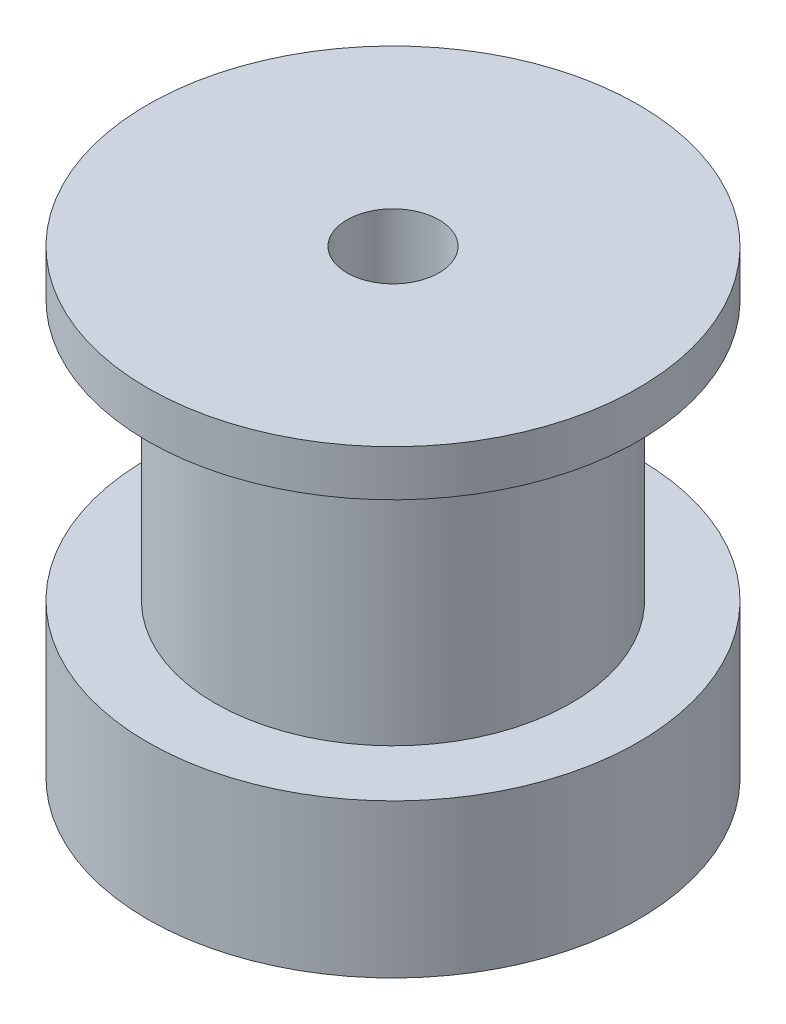
ISO-10303-21;
HEADER;
FILE_DESCRIPTION(('STEP AP214'),'2;1');
FILE_NAME('part.step','',(''),(''),'','','');
FILE_SCHEMA(('AUTOMOTIVE_DESIGN { 1 0 10303 214 1 1 1 1 }'));
ENDSEC;
DATA;
#1=APPLICATION_CONTEXT('core data for automotive mechanical design processes');
#2=APPLICATION_PROTOCOL_DEFINITION('international standard','automotive_design',2000,#1);
#3=PRODUCT_CONTEXT('',#1,'mechanical');
#4=PRODUCT('Part','Part','',(#3));
#5=PRODUCT_RELATED_PRODUCT_CATEGORY('part','',(#4));
#6=PRODUCT_DEFINITION_FORMATION('','',#4);
#7=PRODUCT_DEFINITION_CONTEXT('part definition',#1,'design');
#8=PRODUCT_DEFINITION('design','',#6,#7);
#9=PRODUCT_DEFINITION_SHAPE('','',#8);
#10=(LENGTH_UNIT() NAMED_UNIT(*) SI_UNIT(.MILLI.,.METRE.));
#11=(NAMED_UNIT(*) PLANE_ANGLE_UNIT() SI_UNIT($,.RADIAN.));
#12=(NAMED_UNIT(*) SI_UNIT($,.STERADIAN.) SOLID_ANGLE_UNIT());
#13=UNCERTAINTY_MEASURE_WITH_UNIT(LENGTH_MEASURE(1.E-05),#10,'distance_accuracy_value','');
#14=(GEOMETRIC_REPRESENTATION_CONTEXT(3) GLOBAL_UNCERTAINTY_ASSIGNED_CONTEXT((#13)) GLOBAL_UNIT_ASSIGNED_CONTEXT((#10,
#11,#12)) REPRESENTATION_CONTEXT('',''));
#15=CARTESIAN_POINT('',(0.,0.,0.));
#16=DIRECTION('',(0.,0.,1.));
#17=DIRECTION('',(1.,0.,0.));
#18=AXIS2_PLACEMENT_3D('',#15,#16,#17);
#19=CARTESIAN_POINT('',(0.,5.,0.));
#20=DIRECTION('',(0.,-1.,0.));
#21=DIRECTION('',(0.,0.,-1.));
#22=AXIS2_PLACEMENT_3D('',#19,#20,#21);
#23=CYLINDRICAL_SURFACE('',#22,8.);
#24=CARTESIAN_POINT('',(0.,5.,0.));
#25=DIRECTION('',(0.,1.,0.));
#26=DIRECTION('',(0.,0.,1.));
#27=AXIS2_PLACEMENT_3D('',#24,#25,#26);
#28=CIRCLE('',#27,8.);
#29=CARTESIAN_POINT('',(0.,5.,8.));
#30=VERTEX_POINT('',#29);
#31=EDGE_CURVE('E38',#30,#30,#28,.T.);
#32=ORIENTED_EDGE('',*,*,#31,.F.);
#33=EDGE_LOOP('',(#32));
#34=FACE_BOUND('',#33,.T.);
#35=CARTESIAN_POINT('',(0.,0.,0.));
#36=DIRECTION('',(0.,1.,0.));
#37=DIRECTION('',(0.,0.,1.));
#38=AXIS2_PLACEMENT_3D('',#35,#36,#37);
#39=CIRCLE('',#38,8.);
#40=CARTESIAN_POINT('',(0.,0.,8.));
#41=VERTEX_POINT('',#40);
#42=EDGE_CURVE('E34',#41,#41,#39,.T.);
#43=ORIENTED_EDGE('',*,*,#42,.T.);
#44=EDGE_LOOP('',(#43));
#45=FACE_BOUND('',#44,.T.);
#46=ADVANCED_FACE('F31',(#34,#45),#23,.T.);
#47=CARTESIAN_POINT('',(0.,5.,0.));
#48=DIRECTION('',(0.,1.,0.));
#49=DIRECTION('',(0.,0.,1.));
#50=AXIS2_PLACEMENT_3D('',#47,#48,#49);
#51=PLANE('',#50);
#52=CARTESIAN_POINT('',(0.,5.,0.));
#53=DIRECTION('',(0.,1.,0.));
#54=DIRECTION('',(0.,0.,1.));
#55=AXIS2_PLACEMENT_3D('',#52,#53,#54);
#56=CIRCLE('',#55,5.8);
#57=CARTESIAN_POINT('',(0.,5.,5.8));
#58=VERTEX_POINT('',#57);
#59=EDGE_CURVE('E10',#58,#58,#56,.T.);
#60=ORIENTED_EDGE('',*,*,#59,.F.);
#61=EDGE_LOOP('',(#60));
#62=FACE_BOUND('',#61,.T.);
#63=ORIENTED_EDGE('',*,*,#31,.T.);
#64=EDGE_LOOP('',(#63));
#65=FACE_BOUND('',#64,.T.);
#66=ADVANCED_FACE('F90',(#62,#65),#51,.T.);
#67=CARTESIAN_POINT('',(0.,0.,0.));
#68=DIRECTION('',(0.,1.,0.));
#69=DIRECTION('',(0.,0.,1.));
#70=AXIS2_PLACEMENT_3D('',#67,#68,#69);
#71=PLANE('',#70);
#72=CARTESIAN_POINT('',(0.,0.,0.));
#73=DIRECTION('',(0.,1.,0.));
#74=DIRECTION('',(0.,0.,1.));
#75=AXIS2_PLACEMENT_3D('',#72,#73,#74);
#76=CIRCLE('',#75,1.5);
#77=CARTESIAN_POINT('',(0.,0.,1.5));
#78=VERTEX_POINT('',#77);
#79=EDGE_CURVE('E51',#78,#78,#76,.T.);
#80=ORIENTED_EDGE('',*,*,#79,.T.);
#81=EDGE_LOOP('',(#80));
#82=FACE_BOUND('',#81,.T.);
#83=ORIENTED_EDGE('',*,*,#42,.F.);
#84=EDGE_LOOP('',(#83));
#85=FACE_BOUND('',#84,.T.);
#86=ADVANCED_FACE('F60',(#82,#85),#71,.F.);
#87=CARTESIAN_POINT('',(0.,13.5,0.));
#88=DIRECTION('',(0.,-1.,0.));
#89=DIRECTION('',(0.,0.,-1.));
#90=AXIS2_PLACEMENT_3D('',#87,#88,#89);
#91=CYLINDRICAL_SURFACE('',#90,5.8);
#92=CARTESIAN_POINT('',(0.,13.5,0.));
#93=DIRECTION('',(0.,1.,0.));
#94=DIRECTION('',(0.,0.,1.));
#95=AXIS2_PLACEMENT_3D('',#92,#93,#94);
#96=CIRCLE('',#95,5.8);
#97=CARTESIAN_POINT('',(0.,13.5,5.8));
#98=VERTEX_POINT('',#97);
#99=EDGE_CURVE('E44',#98,#98,#96,.T.);
#100=ORIENTED_EDGE('',*,*,#99,.F.);
#101=EDGE_LOOP('',(#100));
#102=FACE_BOUND('',#101,.T.);
#103=ORIENTED_EDGE('',*,*,#59,.T.);
#104=EDGE_LOOP('',(#103));
#105=FACE_BOUND('',#104,.T.);
#106=ADVANCED_FACE('F79',(#102,#105),#91,.T.);
#107=CARTESIAN_POINT('',(0.,15.,0.));
#108=DIRECTION('',(0.,-1.,0.));
#109=DIRECTION('',(0.,0.,-1.));
#110=AXIS2_PLACEMENT_3D('',#107,#108,#109);
#111=CYLINDRICAL_SURFACE('',#110,8.);
#112=CARTESIAN_POINT('',(0.,15.,0.));
#113=DIRECTION('',(0.,1.,0.));
#114=DIRECTION('',(0.,0.,1.));
#115=AXIS2_PLACEMENT_3D('',#112,#113,#114);
#116=CIRCLE('',#115,8.);
#117=CARTESIAN_POINT('',(0.,15.,8.));
#118=VERTEX_POINT('',#117);
#119=EDGE_CURVE('E47',#118,#118,#116,.T.);
#120=ORIENTED_EDGE('',*,*,#119,.F.);
#121=EDGE_LOOP('',(#120));
#122=FACE_BOUND('',#121,.T.);
#123=CARTESIAN_POINT('',(0.,13.5,0.));
#124=DIRECTION('',(0.,1.,0.));
#125=DIRECTION('',(0.,0.,1.));
#126=AXIS2_PLACEMENT_3D('',#123,#124,#125);
#127=CIRCLE('',#126,8.);
#128=CARTESIAN_POINT('',(0.,13.5,8.));
#129=VERTEX_POINT('',#128);
#130=EDGE_CURVE('E48',#129,#129,#127,.T.);
#131=ORIENTED_EDGE('',*,*,#130,.T.);
#132=EDGE_LOOP('',(#131));
#133=FACE_BOUND('',#132,.T.);
#134=ADVANCED_FACE('F73',(#122,#133),#111,.T.);
#135=CARTESIAN_POINT('',(0.,15.,0.));
#136=DIRECTION('',(0.,1.,0.));
#137=DIRECTION('',(0.,0.,1.));
#138=AXIS2_PLACEMENT_3D('',#135,#136,#137);
#139=PLANE('',#138);
#140=CARTESIAN_POINT('',(0.,15.,0.));
#141=DIRECTION('',(0.,1.,0.));
#142=DIRECTION('',(0.,0.,1.));
#143=AXIS2_PLACEMENT_3D('',#140,#141,#142);
#144=CIRCLE('',#143,1.5);
#145=CARTESIAN_POINT('',(0.,15.,1.5));
#146=VERTEX_POINT('',#145);
#147=EDGE_CURVE('E54',#146,#146,#144,.T.);
#148=ORIENTED_EDGE('',*,*,#147,.F.);
#149=EDGE_LOOP('',(#148));
#150=FACE_BOUND('',#149,.T.);
#151=ORIENTED_EDGE('',*,*,#119,.T.);
#152=EDGE_LOOP('',(#151));
#153=FACE_BOUND('',#152,.T.);
#154=ADVANCED_FACE('F70',(#150,#153),#139,.T.);
#155=CARTESIAN_POINT('',(0.,13.5,0.));
#156=DIRECTION('',(0.,1.,0.));
#157=DIRECTION('',(0.,0.,1.));
#158=AXIS2_PLACEMENT_3D('',#155,#156,#157);
#159=PLANE('',#158);
#160=ORIENTED_EDGE('',*,*,#99,.T.);
#161=EDGE_LOOP('',(#160));
#162=FACE_BOUND('',#161,.T.);
#163=ORIENTED_EDGE('',*,*,#130,.F.);
#164=EDGE_LOOP('',(#163));
#165=FACE_BOUND('',#164,.T.);
#166=ADVANCED_FACE('F66',(#162,#165),#159,.F.);
#167=CARTESIAN_POINT('',(0.,0.,0.));
#168=DIRECTION('',(0.,1.,0.));
#169=DIRECTION('',(0.,0.,1.));
#170=AXIS2_PLACEMENT_3D('',#167,#168,#169);
#171=CYLINDRICAL_SURFACE('',#170,1.5);
#172=ORIENTED_EDGE('',*,*,#79,.F.);
#173=EDGE_LOOP('',(#172));
#174=FACE_BOUND('',#173,.T.);
#175=ORIENTED_EDGE('',*,*,#147,.T.);
#176=EDGE_LOOP('',(#175));
#177=FACE_BOUND('',#176,.T.);
#178=ADVANCED_FACE('F63',(#174,#177),#171,.F.);
#179=CLOSED_SHELL('',(#46,#66,#86,#106,#134,#154,#166,#178));
#180=MANIFOLD_SOLID_BREP('B2',#179);
#181=ADVANCED_BREP_SHAPE_REPRESENTATION('',(#18,#180),#14);
#182=SHAPE_DEFINITION_REPRESENTATION(#9,#181);
ENDSEC;
END-ISO-10303-21;
